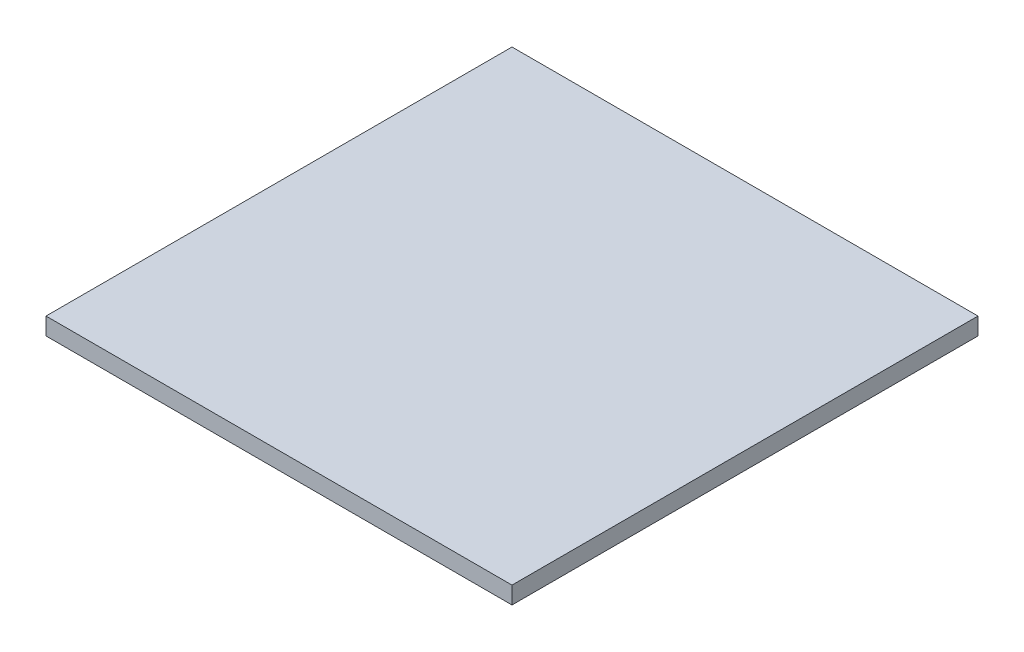
ISO-10303-21;
HEADER;
FILE_DESCRIPTION(('STEP AP214'),'2;1');
FILE_NAME('part.step','',(''),(''),'','','');
FILE_SCHEMA(('AUTOMOTIVE_DESIGN { 1 0 10303 214 1 1 1 1 }'));
ENDSEC;
DATA;
#1=APPLICATION_CONTEXT('core data for automotive mechanical design processes');
#2=APPLICATION_PROTOCOL_DEFINITION('international standard','automotive_design',2000,#1);
#3=PRODUCT_CONTEXT('',#1,'mechanical');
#4=PRODUCT('Part','Part','',(#3));
#5=PRODUCT_RELATED_PRODUCT_CATEGORY('part','',(#4));
#6=PRODUCT_DEFINITION_FORMATION('','',#4);
#7=PRODUCT_DEFINITION_CONTEXT('part definition',#1,'design');
#8=PRODUCT_DEFINITION('design','',#6,#7);
#9=PRODUCT_DEFINITION_SHAPE('','',#8);
#10=(LENGTH_UNIT() NAMED_UNIT(*) SI_UNIT(.MILLI.,.METRE.));
#11=(NAMED_UNIT(*) PLANE_ANGLE_UNIT() SI_UNIT($,.RADIAN.));
#12=(NAMED_UNIT(*) SI_UNIT($,.STERADIAN.) SOLID_ANGLE_UNIT());
#13=UNCERTAINTY_MEASURE_WITH_UNIT(LENGTH_MEASURE(1.E-05),#10,'distance_accuracy_value','');
#14=(GEOMETRIC_REPRESENTATION_CONTEXT(3) GLOBAL_UNCERTAINTY_ASSIGNED_CONTEXT((#13)) GLOBAL_UNIT_ASSIGNED_CONTEXT((#10,
#11,#12)) REPRESENTATION_CONTEXT('',''));
#15=CARTESIAN_POINT('',(0.,0.,0.));
#16=DIRECTION('',(0.,0.,1.));
#17=DIRECTION('',(1.,0.,0.));
#18=AXIS2_PLACEMENT_3D('',#15,#16,#17);
#19=CARTESIAN_POINT('',(135.,10.,-135.));
#20=DIRECTION('',(-1.,0.,0.));
#21=DIRECTION('',(0.,0.,1.));
#22=AXIS2_PLACEMENT_3D('',#19,#20,#21);
#23=PLANE('',#22);
#24=DIRECTION('',(0.,0.,-1.));
#25=VECTOR('',#24,1.);
#26=CARTESIAN_POINT('',(135.,0.,-135.));
#27=LINE('',#26,#25);
#28=CARTESIAN_POINT('',(135.,0.,135.));
#29=VERTEX_POINT('',#28);
#30=CARTESIAN_POINT('',(135.,0.,-135.));
#31=VERTEX_POINT('',#30);
#32=EDGE_CURVE('E96',#29,#31,#27,.T.);
#33=ORIENTED_EDGE('',*,*,#32,.T.);
#34=DIRECTION('',(0.,-1.,0.));
#35=VECTOR('',#34,1.);
#36=CARTESIAN_POINT('',(135.,10.,-135.));
#37=LINE('',#36,#35);
#38=CARTESIAN_POINT('',(135.,10.,-135.));
#39=VERTEX_POINT('',#38);
#40=EDGE_CURVE('E11',#39,#31,#37,.T.);
#41=ORIENTED_EDGE('',*,*,#40,.F.);
#42=DIRECTION('',(0.,0.,-1.));
#43=VECTOR('',#42,1.);
#44=CARTESIAN_POINT('',(135.,10.,-135.));
#45=LINE('',#44,#43);
#46=CARTESIAN_POINT('',(135.,10.,135.));
#47=VERTEX_POINT('',#46);
#48=EDGE_CURVE('E84',#47,#39,#45,.T.);
#49=ORIENTED_EDGE('',*,*,#48,.F.);
#50=DIRECTION('',(0.,-1.,0.));
#51=VECTOR('',#50,1.);
#52=CARTESIAN_POINT('',(135.,10.,135.));
#53=LINE('',#52,#51);
#54=EDGE_CURVE('E92',#47,#29,#53,.T.);
#55=ORIENTED_EDGE('',*,*,#54,.T.);
#56=EDGE_LOOP('',(#33,#41,#49,#55));
#57=FACE_BOUND('',#56,.T.);
#58=ADVANCED_FACE('F33',(#57),#23,.F.);
#59=CARTESIAN_POINT('',(-135.,10.,-135.));
#60=DIRECTION('',(0.,0.,1.));
#61=DIRECTION('',(1.,0.,0.));
#62=AXIS2_PLACEMENT_3D('',#59,#60,#61);
#63=PLANE('',#62);
#64=DIRECTION('',(-1.,0.,0.));
#65=VECTOR('',#64,1.);
#66=CARTESIAN_POINT('',(-135.,0.,-135.));
#67=LINE('',#66,#65);
#68=CARTESIAN_POINT('',(-135.,0.,-135.));
#69=VERTEX_POINT('',#68);
#70=EDGE_CURVE('E88',#31,#69,#67,.T.);
#71=ORIENTED_EDGE('',*,*,#70,.T.);
#72=DIRECTION('',(0.,-1.,0.));
#73=VECTOR('',#72,1.);
#74=CARTESIAN_POINT('',(-135.,10.,-135.));
#75=LINE('',#74,#73);
#76=CARTESIAN_POINT('',(-135.,10.,-135.));
#77=VERTEX_POINT('',#76);
#78=EDGE_CURVE('E41',#77,#69,#75,.T.);
#79=ORIENTED_EDGE('',*,*,#78,.F.);
#80=DIRECTION('',(-1.,0.,0.));
#81=VECTOR('',#80,1.);
#82=CARTESIAN_POINT('',(-135.,10.,-135.));
#83=LINE('',#82,#81);
#84=EDGE_CURVE('E79',#39,#77,#83,.T.);
#85=ORIENTED_EDGE('',*,*,#84,.F.);
#86=ORIENTED_EDGE('',*,*,#40,.T.);
#87=EDGE_LOOP('',(#71,#79,#85,#86));
#88=FACE_BOUND('',#87,.T.);
#89=ADVANCED_FACE('F87',(#88),#63,.F.);
#90=CARTESIAN_POINT('',(-135.,10.,-135.));
#91=DIRECTION('',(1.,0.,0.));
#92=DIRECTION('',(0.,0.,-1.));
#93=AXIS2_PLACEMENT_3D('',#90,#91,#92);
#94=PLANE('',#93);
#95=DIRECTION('',(0.,0.,1.));
#96=VECTOR('',#95,1.);
#97=CARTESIAN_POINT('',(-135.,0.,-135.));
#98=LINE('',#97,#96);
#99=CARTESIAN_POINT('',(-135.,0.,135.));
#100=VERTEX_POINT('',#99);
#101=EDGE_CURVE('E66',#69,#100,#98,.T.);
#102=ORIENTED_EDGE('',*,*,#101,.T.);
#103=DIRECTION('',(0.,-1.,0.));
#104=VECTOR('',#103,1.);
#105=CARTESIAN_POINT('',(-135.,10.,135.));
#106=LINE('',#105,#104);
#107=CARTESIAN_POINT('',(-135.,10.,135.));
#108=VERTEX_POINT('',#107);
#109=EDGE_CURVE('E89',#108,#100,#106,.T.);
#110=ORIENTED_EDGE('',*,*,#109,.F.);
#111=DIRECTION('',(0.,0.,1.));
#112=VECTOR('',#111,1.);
#113=CARTESIAN_POINT('',(-135.,10.,-135.));
#114=LINE('',#113,#112);
#115=EDGE_CURVE('E82',#77,#108,#114,.T.);
#116=ORIENTED_EDGE('',*,*,#115,.F.);
#117=ORIENTED_EDGE('',*,*,#78,.T.);
#118=EDGE_LOOP('',(#102,#110,#116,#117));
#119=FACE_BOUND('',#118,.T.);
#120=ADVANCED_FACE('F90',(#119),#94,.F.);
#121=CARTESIAN_POINT('',(-135.,10.,135.));
#122=DIRECTION('',(0.,0.,-1.));
#123=DIRECTION('',(-1.,0.,0.));
#124=AXIS2_PLACEMENT_3D('',#121,#122,#123);
#125=PLANE('',#124);
#126=DIRECTION('',(1.,0.,0.));
#127=VECTOR('',#126,1.);
#128=CARTESIAN_POINT('',(-135.,0.,135.));
#129=LINE('',#128,#127);
#130=EDGE_CURVE('E72',#100,#29,#129,.T.);
#131=ORIENTED_EDGE('',*,*,#130,.T.);
#132=ORIENTED_EDGE('',*,*,#54,.F.);
#133=DIRECTION('',(1.,0.,0.));
#134=VECTOR('',#133,1.);
#135=CARTESIAN_POINT('',(-135.,10.,135.));
#136=LINE('',#135,#134);
#137=EDGE_CURVE('E49',#108,#47,#136,.T.);
#138=ORIENTED_EDGE('',*,*,#137,.F.);
#139=ORIENTED_EDGE('',*,*,#109,.T.);
#140=EDGE_LOOP('',(#131,#132,#138,#139));
#141=FACE_BOUND('',#140,.T.);
#142=ADVANCED_FACE('F103',(#141),#125,.F.);
#143=CARTESIAN_POINT('',(0.,10.,0.));
#144=DIRECTION('',(0.,1.,0.));
#145=DIRECTION('',(0.,0.,1.));
#146=AXIS2_PLACEMENT_3D('',#143,#144,#145);
#147=PLANE('',#146);
#148=ORIENTED_EDGE('',*,*,#48,.T.);
#149=ORIENTED_EDGE('',*,*,#84,.T.);
#150=ORIENTED_EDGE('',*,*,#115,.T.);
#151=ORIENTED_EDGE('',*,*,#137,.T.);
#152=EDGE_LOOP('',(#148,#149,#150,#151));
#153=FACE_BOUND('',#152,.T.);
#154=ADVANCED_FACE('F80',(#153),#147,.T.);
#155=CARTESIAN_POINT('',(0.,0.,0.));
#156=DIRECTION('',(0.,1.,0.));
#157=DIRECTION('',(0.,0.,1.));
#158=AXIS2_PLACEMENT_3D('',#155,#156,#157);
#159=PLANE('',#158);
#160=ORIENTED_EDGE('',*,*,#32,.F.);
#161=ORIENTED_EDGE('',*,*,#130,.F.);
#162=ORIENTED_EDGE('',*,*,#101,.F.);
#163=ORIENTED_EDGE('',*,*,#70,.F.);
#164=EDGE_LOOP('',(#160,#161,#162,#163));
#165=FACE_BOUND('',#164,.T.);
#166=ADVANCED_FACE('F106',(#165),#159,.F.);
#167=CLOSED_SHELL('',(#58,#89,#120,#142,#154,#166));
#168=MANIFOLD_SOLID_BREP('B2',#167);
#169=ADVANCED_BREP_SHAPE_REPRESENTATION('',(#18,#168),#14);
#170=SHAPE_DEFINITION_REPRESENTATION(#9,#169);
ENDSEC;
END-ISO-10303-21;
